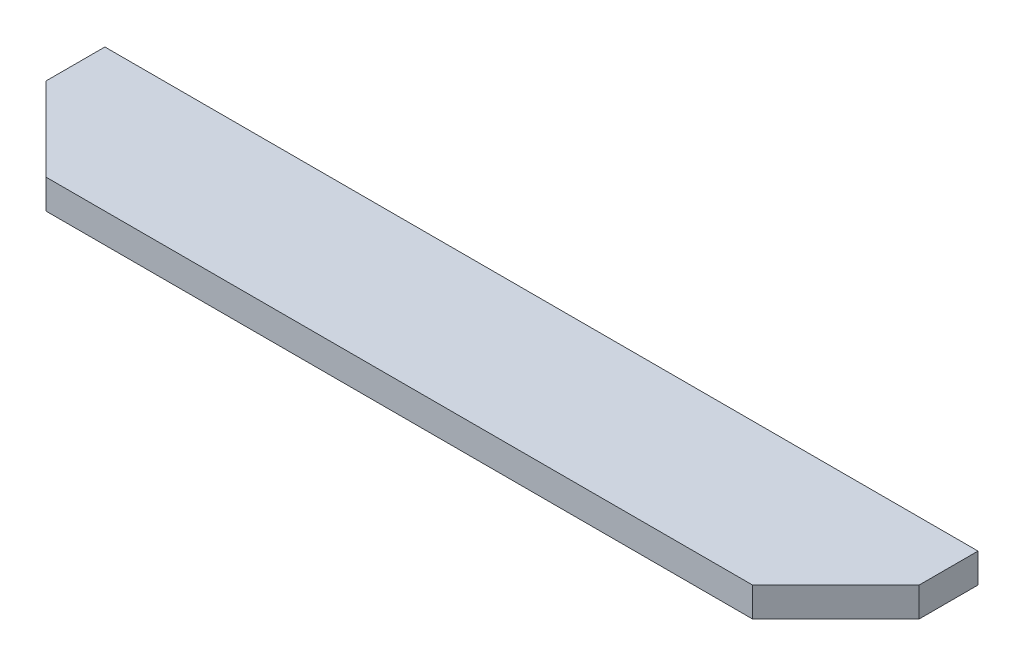
ISO-10303-21;
HEADER;
FILE_DESCRIPTION(('STEP AP214'),'2;1');
FILE_NAME('part.step','',(''),(''),'','','');
FILE_SCHEMA(('AUTOMOTIVE_DESIGN { 1 0 10303 214 1 1 1 1 }'));
ENDSEC;
DATA;
#1=APPLICATION_CONTEXT('core data for automotive mechanical design processes');
#2=APPLICATION_PROTOCOL_DEFINITION('international standard','automotive_design',2000,#1);
#3=PRODUCT_CONTEXT('',#1,'mechanical');
#4=PRODUCT('Part','Part','',(#3));
#5=PRODUCT_RELATED_PRODUCT_CATEGORY('part','',(#4));
#6=PRODUCT_DEFINITION_FORMATION('','',#4);
#7=PRODUCT_DEFINITION_CONTEXT('part definition',#1,'design');
#8=PRODUCT_DEFINITION('design','',#6,#7);
#9=PRODUCT_DEFINITION_SHAPE('','',#8);
#10=(LENGTH_UNIT() NAMED_UNIT(*) SI_UNIT(.MILLI.,.METRE.));
#11=(NAMED_UNIT(*) PLANE_ANGLE_UNIT() SI_UNIT($,.RADIAN.));
#12=(NAMED_UNIT(*) SI_UNIT($,.STERADIAN.) SOLID_ANGLE_UNIT());
#13=UNCERTAINTY_MEASURE_WITH_UNIT(LENGTH_MEASURE(1.E-05),#10,'distance_accuracy_value','');
#14=(GEOMETRIC_REPRESENTATION_CONTEXT(3) GLOBAL_UNCERTAINTY_ASSIGNED_CONTEXT((#13)) GLOBAL_UNIT_ASSIGNED_CONTEXT((#10,
#11,#12)) REPRESENTATION_CONTEXT('',''));
#15=CARTESIAN_POINT('',(0.,0.,0.));
#16=DIRECTION('',(0.,0.,1.));
#17=DIRECTION('',(1.,0.,0.));
#18=AXIS2_PLACEMENT_3D('',#15,#16,#17);
#19=CARTESIAN_POINT('',(0.,5.,0.));
#20=DIRECTION('',(-0.707106781186547,0.,-0.707106781186547));
#21=DIRECTION('',(-0.707106781186548,0.,0.707106781186548));
#22=AXIS2_PLACEMENT_3D('',#19,#20,#21);
#23=PLANE('',#22);
#24=DIRECTION('',(0.707106781186548,0.,-0.707106781186548));
#25=VECTOR('',#24,1.);
#26=CARTESIAN_POINT('',(0.,0.,0.));
#27=LINE('',#26,#25);
#28=CARTESIAN_POINT('',(0.,0.,0.));
#29=VERTEX_POINT('',#28);
#30=CARTESIAN_POINT('',(14.1421356237309,0.,-14.1421356237309));
#31=VERTEX_POINT('',#30);
#32=EDGE_CURVE('E117',#29,#31,#27,.T.);
#33=ORIENTED_EDGE('',*,*,#32,.T.);
#34=DIRECTION('',(0.,-1.,0.));
#35=VECTOR('',#34,1.);
#36=CARTESIAN_POINT('',(14.1421356237309,5.,-14.1421356237309));
#37=LINE('',#36,#35);
#38=CARTESIAN_POINT('',(14.1421356237309,5.,-14.1421356237309));
#39=VERTEX_POINT('',#38);
#40=EDGE_CURVE('E11',#39,#31,#37,.T.);
#41=ORIENTED_EDGE('',*,*,#40,.F.);
#42=DIRECTION('',(0.707106781186548,0.,-0.707106781186548));
#43=VECTOR('',#42,1.);
#44=CARTESIAN_POINT('',(0.,5.,0.));
#45=LINE('',#44,#43);
#46=CARTESIAN_POINT('',(0.,5.,0.));
#47=VERTEX_POINT('',#46);
#48=EDGE_CURVE('E127',#47,#39,#45,.T.);
#49=ORIENTED_EDGE('',*,*,#48,.F.);
#50=DIRECTION('',(0.,-1.,0.));
#51=VECTOR('',#50,1.);
#52=CARTESIAN_POINT('',(0.,5.,0.));
#53=LINE('',#52,#51);
#54=EDGE_CURVE('E113',#47,#29,#53,.T.);
#55=ORIENTED_EDGE('',*,*,#54,.T.);
#56=EDGE_LOOP('',(#33,#41,#49,#55));
#57=FACE_BOUND('',#56,.T.);
#58=ADVANCED_FACE('F33',(#57),#23,.F.);
#59=CARTESIAN_POINT('',(14.1421356237309,5.,-14.1421356237309));
#60=DIRECTION('',(-1.,0.,0.));
#61=DIRECTION('',(0.,0.,1.));
#62=AXIS2_PLACEMENT_3D('',#59,#60,#61);
#63=PLANE('',#62);
#64=DIRECTION('',(0.,0.,-1.));
#65=VECTOR('',#64,1.);
#66=CARTESIAN_POINT('',(14.1421356237309,0.,-14.1421356237309));
#67=LINE('',#66,#65);
#68=CARTESIAN_POINT('',(14.1421356237309,0.,-24.142135623731));
#69=VERTEX_POINT('',#68);
#70=EDGE_CURVE('E120',#31,#69,#67,.T.);
#71=ORIENTED_EDGE('',*,*,#70,.T.);
#72=DIRECTION('',(0.,-1.,0.));
#73=VECTOR('',#72,1.);
#74=CARTESIAN_POINT('',(14.1421356237309,5.,-24.142135623731));
#75=LINE('',#74,#73);
#76=CARTESIAN_POINT('',(14.1421356237309,5.,-24.142135623731));
#77=VERTEX_POINT('',#76);
#78=EDGE_CURVE('E41',#77,#69,#75,.T.);
#79=ORIENTED_EDGE('',*,*,#78,.F.);
#80=DIRECTION('',(0.,0.,-1.));
#81=VECTOR('',#80,1.);
#82=CARTESIAN_POINT('',(14.1421356237309,5.,-14.1421356237309));
#83=LINE('',#82,#81);
#84=EDGE_CURVE('E86',#39,#77,#83,.T.);
#85=ORIENTED_EDGE('',*,*,#84,.F.);
#86=ORIENTED_EDGE('',*,*,#40,.T.);
#87=EDGE_LOOP('',(#71,#79,#85,#86));
#88=FACE_BOUND('',#87,.T.);
#89=ADVANCED_FACE('F151',(#88),#63,.F.);
#90=CARTESIAN_POINT('',(14.1421356237309,5.,-24.142135623731));
#91=DIRECTION('',(0.,0.,1.));
#92=DIRECTION('',(1.,0.,0.));
#93=AXIS2_PLACEMENT_3D('',#90,#91,#92);
#94=PLANE('',#93);
#95=DIRECTION('',(-1.,0.,0.));
#96=VECTOR('',#95,1.);
#97=CARTESIAN_POINT('',(14.1421356237309,0.,-24.142135623731));
#98=LINE('',#97,#96);
#99=CARTESIAN_POINT('',(-134.142135623731,0.,-24.1421356237309));
#100=VERTEX_POINT('',#99);
#101=EDGE_CURVE('E122',#69,#100,#98,.T.);
#102=ORIENTED_EDGE('',*,*,#101,.T.);
#103=DIRECTION('',(0.,-1.,0.));
#104=VECTOR('',#103,1.);
#105=CARTESIAN_POINT('',(-134.142135623731,5.,-24.1421356237309));
#106=LINE('',#105,#104);
#107=CARTESIAN_POINT('',(-134.142135623731,5.,-24.1421356237309));
#108=VERTEX_POINT('',#107);
#109=EDGE_CURVE('E108',#108,#100,#106,.T.);
#110=ORIENTED_EDGE('',*,*,#109,.F.);
#111=DIRECTION('',(-1.,0.,0.));
#112=VECTOR('',#111,1.);
#113=CARTESIAN_POINT('',(14.1421356237309,5.,-24.142135623731));
#114=LINE('',#113,#112);
#115=EDGE_CURVE('E99',#77,#108,#114,.T.);
#116=ORIENTED_EDGE('',*,*,#115,.F.);
#117=ORIENTED_EDGE('',*,*,#78,.T.);
#118=EDGE_LOOP('',(#102,#110,#116,#117));
#119=FACE_BOUND('',#118,.T.);
#120=ADVANCED_FACE('F133',(#119),#94,.F.);
#121=CARTESIAN_POINT('',(-134.142135623731,5.,-14.1421356237309));
#122=DIRECTION('',(1.,0.,0.));
#123=DIRECTION('',(0.,0.,-1.));
#124=AXIS2_PLACEMENT_3D('',#121,#122,#123);
#125=PLANE('',#124);
#126=DIRECTION('',(0.,0.,1.));
#127=VECTOR('',#126,1.);
#128=CARTESIAN_POINT('',(-134.142135623731,0.,-14.1421356237309));
#129=LINE('',#128,#127);
#130=CARTESIAN_POINT('',(-134.142135623731,0.,-14.1421356237309));
#131=VERTEX_POINT('',#130);
#132=EDGE_CURVE('E107',#100,#131,#129,.T.);
#133=ORIENTED_EDGE('',*,*,#132,.T.);
#134=DIRECTION('',(0.,-1.,0.));
#135=VECTOR('',#134,1.);
#136=CARTESIAN_POINT('',(-134.142135623731,5.,-14.1421356237309));
#137=LINE('',#136,#135);
#138=CARTESIAN_POINT('',(-134.142135623731,5.,-14.1421356237309));
#139=VERTEX_POINT('',#138);
#140=EDGE_CURVE('E104',#139,#131,#137,.T.);
#141=ORIENTED_EDGE('',*,*,#140,.F.);
#142=DIRECTION('',(0.,0.,1.));
#143=VECTOR('',#142,1.);
#144=CARTESIAN_POINT('',(-134.142135623731,5.,-14.1421356237309));
#145=LINE('',#144,#143);
#146=EDGE_CURVE('E93',#108,#139,#145,.T.);
#147=ORIENTED_EDGE('',*,*,#146,.F.);
#148=ORIENTED_EDGE('',*,*,#109,.T.);
#149=EDGE_LOOP('',(#133,#141,#147,#148));
#150=FACE_BOUND('',#149,.T.);
#151=ADVANCED_FACE('F105',(#150),#125,.F.);
#152=CARTESIAN_POINT('',(-120.,5.,0.));
#153=DIRECTION('',(0.707106781186547,0.,-0.707106781186548));
#154=DIRECTION('',(-0.707106781186548,0.,-0.707106781186547));
#155=AXIS2_PLACEMENT_3D('',#152,#153,#154);
#156=PLANE('',#155);
#157=DIRECTION('',(0.707106781186548,0.,0.707106781186547));
#158=VECTOR('',#157,1.);
#159=CARTESIAN_POINT('',(-120.,0.,0.));
#160=LINE('',#159,#158);
#161=CARTESIAN_POINT('',(-120.,0.,0.));
#162=VERTEX_POINT('',#161);
#163=EDGE_CURVE('E72',#131,#162,#160,.T.);
#164=ORIENTED_EDGE('',*,*,#163,.T.);
#165=DIRECTION('',(0.,-1.,0.));
#166=VECTOR('',#165,1.);
#167=CARTESIAN_POINT('',(-120.,5.,0.));
#168=LINE('',#167,#166);
#169=CARTESIAN_POINT('',(-120.,5.,0.));
#170=VERTEX_POINT('',#169);
#171=EDGE_CURVE('E109',#170,#162,#168,.T.);
#172=ORIENTED_EDGE('',*,*,#171,.F.);
#173=DIRECTION('',(0.707106781186548,0.,0.707106781186547));
#174=VECTOR('',#173,1.);
#175=CARTESIAN_POINT('',(-120.,5.,0.));
#176=LINE('',#175,#174);
#177=EDGE_CURVE('E97',#139,#170,#176,.T.);
#178=ORIENTED_EDGE('',*,*,#177,.F.);
#179=ORIENTED_EDGE('',*,*,#140,.T.);
#180=EDGE_LOOP('',(#164,#172,#178,#179));
#181=FACE_BOUND('',#180,.T.);
#182=ADVANCED_FACE('F111',(#181),#156,.F.);
#183=CARTESIAN_POINT('',(0.,5.,0.));
#184=DIRECTION('',(0.,0.,-1.));
#185=DIRECTION('',(-1.,0.,0.));
#186=AXIS2_PLACEMENT_3D('',#183,#184,#185);
#187=PLANE('',#186);
#188=DIRECTION('',(1.,0.,0.));
#189=VECTOR('',#188,1.);
#190=CARTESIAN_POINT('',(0.,0.,0.));
#191=LINE('',#190,#189);
#192=EDGE_CURVE('E78',#162,#29,#191,.T.);
#193=ORIENTED_EDGE('',*,*,#192,.T.);
#194=ORIENTED_EDGE('',*,*,#54,.F.);
#195=DIRECTION('',(1.,0.,0.));
#196=VECTOR('',#195,1.);
#197=CARTESIAN_POINT('',(0.,5.,0.));
#198=LINE('',#197,#196);
#199=EDGE_CURVE('E49',#170,#47,#198,.T.);
#200=ORIENTED_EDGE('',*,*,#199,.F.);
#201=ORIENTED_EDGE('',*,*,#171,.T.);
#202=EDGE_LOOP('',(#193,#194,#200,#201));
#203=FACE_BOUND('',#202,.T.);
#204=ADVANCED_FACE('F140',(#203),#187,.F.);
#205=CARTESIAN_POINT('',(0.,5.,0.));
#206=DIRECTION('',(0.,1.,0.));
#207=DIRECTION('',(0.,0.,1.));
#208=AXIS2_PLACEMENT_3D('',#205,#206,#207);
#209=PLANE('',#208);
#210=ORIENTED_EDGE('',*,*,#48,.T.);
#211=ORIENTED_EDGE('',*,*,#84,.T.);
#212=ORIENTED_EDGE('',*,*,#115,.T.);
#213=ORIENTED_EDGE('',*,*,#146,.T.);
#214=ORIENTED_EDGE('',*,*,#177,.T.);
#215=ORIENTED_EDGE('',*,*,#199,.T.);
#216=EDGE_LOOP('',(#210,#211,#212,#213,#214,#215));
#217=FACE_BOUND('',#216,.T.);
#218=ADVANCED_FACE('F95',(#217),#209,.T.);
#219=CARTESIAN_POINT('',(0.,0.,0.));
#220=DIRECTION('',(0.,1.,0.));
#221=DIRECTION('',(0.,0.,1.));
#222=AXIS2_PLACEMENT_3D('',#219,#220,#221);
#223=PLANE('',#222);
#224=ORIENTED_EDGE('',*,*,#32,.F.);
#225=ORIENTED_EDGE('',*,*,#192,.F.);
#226=ORIENTED_EDGE('',*,*,#163,.F.);
#227=ORIENTED_EDGE('',*,*,#132,.F.);
#228=ORIENTED_EDGE('',*,*,#101,.F.);
#229=ORIENTED_EDGE('',*,*,#70,.F.);
#230=EDGE_LOOP('',(#224,#225,#226,#227,#228,#229));
#231=FACE_BOUND('',#230,.T.);
#232=ADVANCED_FACE('F136',(#231),#223,.F.);
#233=CLOSED_SHELL('',(#58,#89,#120,#151,#182,#204,#218,#232));
#234=MANIFOLD_SOLID_BREP('B2',#233);
#235=ADVANCED_BREP_SHAPE_REPRESENTATION('',(#18,#234),#14);
#236=SHAPE_DEFINITION_REPRESENTATION(#9,#235);
ENDSEC;
END-ISO-10303-21;
